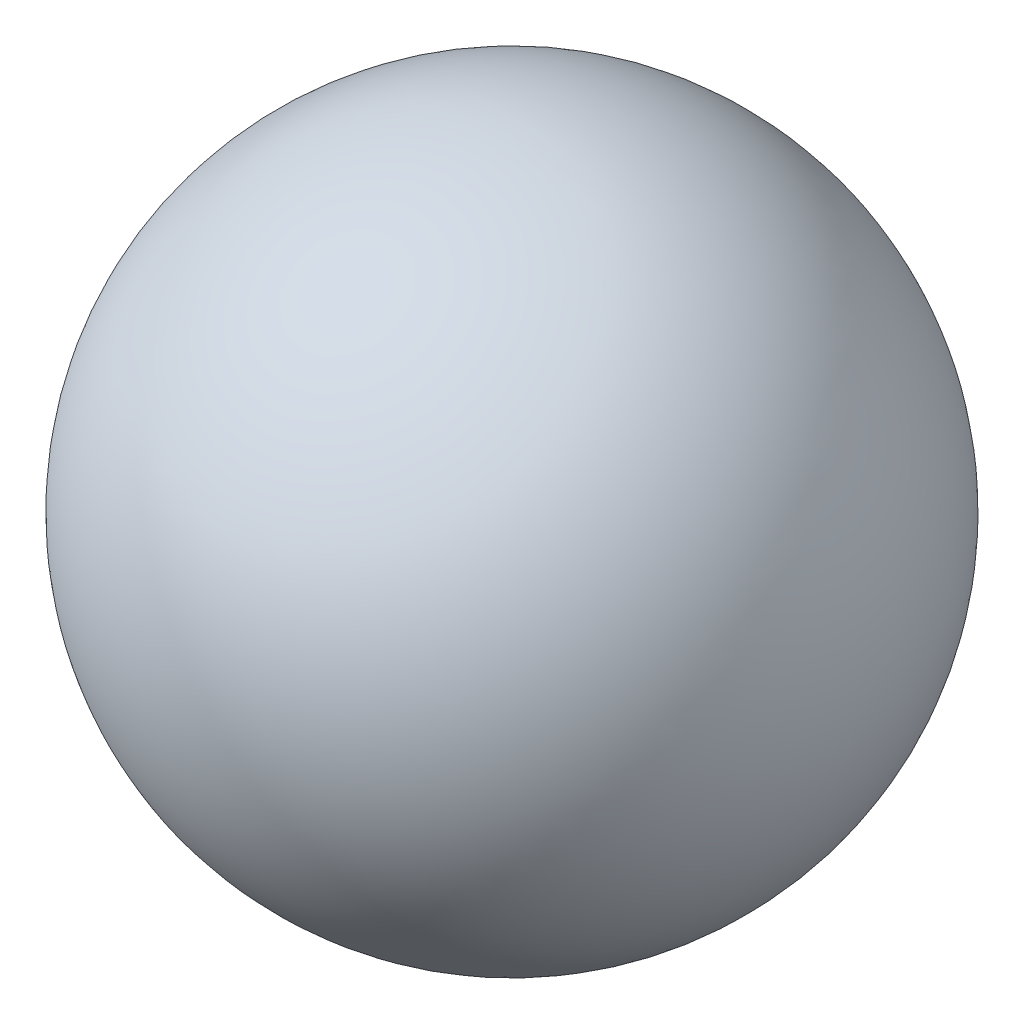
ISO-10303-21;
HEADER;
FILE_DESCRIPTION(('STEP AP214'),'2;1');
FILE_NAME('part.step','',(''),(''),'','','');
FILE_SCHEMA(('AUTOMOTIVE_DESIGN { 1 0 10303 214 1 1 1 1 }'));
ENDSEC;
DATA;
#1=APPLICATION_CONTEXT('core data for automotive mechanical design processes');
#2=APPLICATION_PROTOCOL_DEFINITION('international standard','automotive_design',2000,#1);
#3=PRODUCT_CONTEXT('',#1,'mechanical');
#4=PRODUCT('Part','Part','',(#3));
#5=PRODUCT_RELATED_PRODUCT_CATEGORY('part','',(#4));
#6=PRODUCT_DEFINITION_FORMATION('','',#4);
#7=PRODUCT_DEFINITION_CONTEXT('part definition',#1,'design');
#8=PRODUCT_DEFINITION('design','',#6,#7);
#9=PRODUCT_DEFINITION_SHAPE('','',#8);
#10=(LENGTH_UNIT() NAMED_UNIT(*) SI_UNIT(.MILLI.,.METRE.));
#11=(NAMED_UNIT(*) PLANE_ANGLE_UNIT() SI_UNIT($,.RADIAN.));
#12=(NAMED_UNIT(*) SI_UNIT($,.STERADIAN.) SOLID_ANGLE_UNIT());
#13=UNCERTAINTY_MEASURE_WITH_UNIT(LENGTH_MEASURE(1.E-05),#10,'distance_accuracy_value','');
#14=(GEOMETRIC_REPRESENTATION_CONTEXT(3) GLOBAL_UNCERTAINTY_ASSIGNED_CONTEXT((#13)) GLOBAL_UNIT_ASSIGNED_CONTEXT((#10,
#11,#12)) REPRESENTATION_CONTEXT('',''));
#15=CARTESIAN_POINT('',(0.,0.,0.));
#16=DIRECTION('',(0.,0.,1.));
#17=DIRECTION('',(1.,0.,0.));
#18=AXIS2_PLACEMENT_3D('',#15,#16,#17);
#19=CARTESIAN_POINT('',(0.,0.,0.));
#20=DIRECTION('',(0.,0.,-1.));
#21=DIRECTION('',(1.,0.,0.));
#22=AXIS2_PLACEMENT_3D('',#19,#20,#21);
#23=SPHERICAL_SURFACE('',#22,7.);
#24=CARTESIAN_POINT('',(0.,0.,-7.));
#25=VERTEX_POINT('',#24);
#26=VERTEX_LOOP('',#25);
#27=FACE_BOUND('',#26,.T.);
#28=ADVANCED_FACE('F39',(#27),#23,.T.);
#29=CLOSED_SHELL('',(#28));
#30=MANIFOLD_SOLID_BREP('B2',#29);
#31=ADVANCED_BREP_SHAPE_REPRESENTATION('',(#18,#30),#14);
#32=SHAPE_DEFINITION_REPRESENTATION(#9,#31);
ENDSEC;
END-ISO-10303-21;
